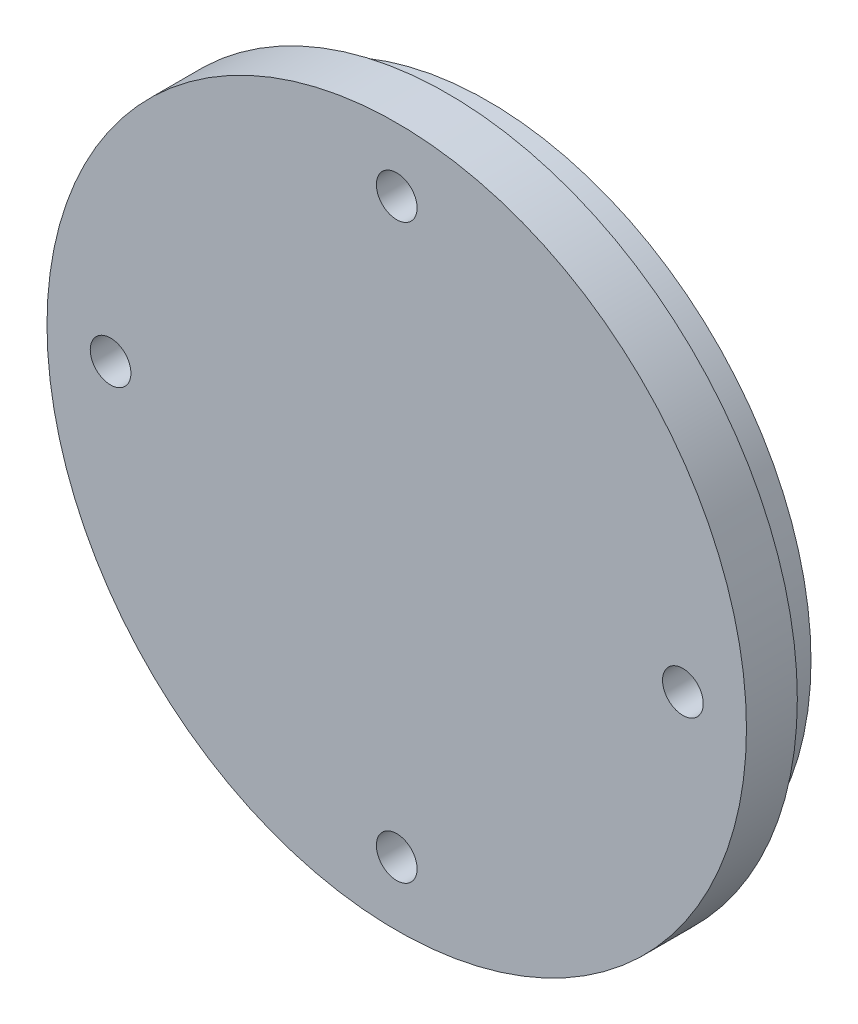
ISO-10303-21;
HEADER;
FILE_DESCRIPTION(('STEP AP214'),'2;1');
FILE_NAME('part.step','',(''),(''),'','','');
FILE_SCHEMA(('AUTOMOTIVE_DESIGN { 1 0 10303 214 1 1 1 1 }'));
ENDSEC;
DATA;
#1=APPLICATION_CONTEXT('core data for automotive mechanical design processes');
#2=APPLICATION_PROTOCOL_DEFINITION('international standard','automotive_design',2000,#1);
#3=PRODUCT_CONTEXT('',#1,'mechanical');
#4=PRODUCT('Part','Part','',(#3));
#5=PRODUCT_RELATED_PRODUCT_CATEGORY('part','',(#4));
#6=PRODUCT_DEFINITION_FORMATION('','',#4);
#7=PRODUCT_DEFINITION_CONTEXT('part definition',#1,'design');
#8=PRODUCT_DEFINITION('design','',#6,#7);
#9=PRODUCT_DEFINITION_SHAPE('','',#8);
#10=(LENGTH_UNIT() NAMED_UNIT(*) SI_UNIT(.MILLI.,.METRE.));
#11=(NAMED_UNIT(*) PLANE_ANGLE_UNIT() SI_UNIT($,.RADIAN.));
#12=(NAMED_UNIT(*) SI_UNIT($,.STERADIAN.) SOLID_ANGLE_UNIT());
#13=UNCERTAINTY_MEASURE_WITH_UNIT(LENGTH_MEASURE(1.E-05),#10,'distance_accuracy_value','');
#14=(GEOMETRIC_REPRESENTATION_CONTEXT(3) GLOBAL_UNCERTAINTY_ASSIGNED_CONTEXT((#13)) GLOBAL_UNIT_ASSIGNED_CONTEXT((#10,
#11,#12)) REPRESENTATION_CONTEXT('',''));
#15=CARTESIAN_POINT('',(0.,0.,0.));
#16=DIRECTION('',(0.,0.,1.));
#17=DIRECTION('',(1.,0.,0.));
#18=AXIS2_PLACEMENT_3D('',#15,#16,#17);
#19=CARTESIAN_POINT('',(0.,0.,4.));
#20=DIRECTION('',(0.,0.,-1.));
#21=DIRECTION('',(-1.,0.,0.));
#22=AXIS2_PLACEMENT_3D('',#19,#20,#21);
#23=CYLINDRICAL_SURFACE('',#22,27.5);
#24=CARTESIAN_POINT('',(0.,0.,4.));
#25=DIRECTION('',(0.,0.,1.));
#26=DIRECTION('',(1.,0.,0.));
#27=AXIS2_PLACEMENT_3D('',#24,#25,#26);
#28=CIRCLE('',#27,27.5);
#29=CARTESIAN_POINT('',(27.5,0.,4.));
#30=VERTEX_POINT('',#29);
#31=EDGE_CURVE('E40',#30,#30,#28,.T.);
#32=ORIENTED_EDGE('',*,*,#31,.F.);
#33=EDGE_LOOP('',(#32));
#34=FACE_BOUND('',#33,.T.);
#35=CARTESIAN_POINT('',(0.,0.,0.));
#36=DIRECTION('',(0.,0.,1.));
#37=DIRECTION('',(1.,0.,0.));
#38=AXIS2_PLACEMENT_3D('',#35,#36,#37);
#39=CIRCLE('',#38,27.5);
#40=CARTESIAN_POINT('',(27.5,0.,0.));
#41=VERTEX_POINT('',#40);
#42=EDGE_CURVE('E36',#41,#41,#39,.T.);
#43=ORIENTED_EDGE('',*,*,#42,.T.);
#44=EDGE_LOOP('',(#43));
#45=FACE_BOUND('',#44,.T.);
#46=ADVANCED_FACE('F33',(#34,#45),#23,.T.);
#47=CARTESIAN_POINT('',(0.,0.,4.));
#48=DIRECTION('',(0.,0.,1.));
#49=DIRECTION('',(1.,0.,0.));
#50=AXIS2_PLACEMENT_3D('',#47,#48,#49);
#51=PLANE('',#50);
#52=CARTESIAN_POINT('',(0.,22.5,4.));
#53=DIRECTION('',(0.,0.,-1.));
#54=DIRECTION('',(-1.,0.,0.));
#55=AXIS2_PLACEMENT_3D('',#52,#53,#54);
#56=CIRCLE('',#55,1.6);
#57=CARTESIAN_POINT('',(-1.6,22.5,4.));
#58=VERTEX_POINT('',#57);
#59=EDGE_CURVE('E49',#58,#58,#56,.T.);
#60=ORIENTED_EDGE('',*,*,#59,.T.);
#61=EDGE_LOOP('',(#60));
#62=FACE_BOUND('',#61,.T.);
#63=CARTESIAN_POINT('',(-22.5,0.,4.));
#64=DIRECTION('',(0.,0.,-1.));
#65=DIRECTION('',(-1.,0.,0.));
#66=AXIS2_PLACEMENT_3D('',#63,#64,#65);
#67=CIRCLE('',#66,1.6);
#68=CARTESIAN_POINT('',(-24.1,0.,4.));
#69=VERTEX_POINT('',#68);
#70=EDGE_CURVE('E65',#69,#69,#67,.T.);
#71=ORIENTED_EDGE('',*,*,#70,.T.);
#72=EDGE_LOOP('',(#71));
#73=FACE_BOUND('',#72,.T.);
#74=CARTESIAN_POINT('',(0.,-22.5,4.));
#75=DIRECTION('',(0.,0.,-1.));
#76=DIRECTION('',(-1.,0.,0.));
#77=AXIS2_PLACEMENT_3D('',#74,#75,#76);
#78=CIRCLE('',#77,1.6);
#79=CARTESIAN_POINT('',(-1.6,-22.5,4.));
#80=VERTEX_POINT('',#79);
#81=EDGE_CURVE('E59',#80,#80,#78,.T.);
#82=ORIENTED_EDGE('',*,*,#81,.T.);
#83=EDGE_LOOP('',(#82));
#84=FACE_BOUND('',#83,.T.);
#85=CARTESIAN_POINT('',(22.5,0.,4.));
#86=DIRECTION('',(0.,0.,-1.));
#87=DIRECTION('',(-1.,0.,0.));
#88=AXIS2_PLACEMENT_3D('',#85,#86,#87);
#89=CIRCLE('',#88,1.6);
#90=CARTESIAN_POINT('',(20.9,0.,4.));
#91=VERTEX_POINT('',#90);
#92=EDGE_CURVE('E53',#91,#91,#89,.T.);
#93=ORIENTED_EDGE('',*,*,#92,.T.);
#94=EDGE_LOOP('',(#93));
#95=FACE_BOUND('',#94,.T.);
#96=ORIENTED_EDGE('',*,*,#31,.T.);
#97=EDGE_LOOP('',(#96));
#98=FACE_BOUND('',#97,.T.);
#99=ADVANCED_FACE('F74',(#62,#73,#84,#95,#98),#51,.T.);
#100=CARTESIAN_POINT('',(0.,0.,0.));
#101=DIRECTION('',(0.,0.,1.));
#102=DIRECTION('',(1.,0.,0.));
#103=AXIS2_PLACEMENT_3D('',#100,#101,#102);
#104=PLANE('',#103);
#105=CARTESIAN_POINT('',(0.,0.,0.));
#106=DIRECTION('',(0.,0.,-1.));
#107=DIRECTION('',(-1.,0.,0.));
#108=AXIS2_PLACEMENT_3D('',#105,#106,#107);
#109=CIRCLE('',#108,25.4);
#110=CARTESIAN_POINT('',(-25.4,0.,0.));
#111=VERTEX_POINT('',#110);
#112=EDGE_CURVE('E10',#111,#111,#109,.T.);
#113=ORIENTED_EDGE('',*,*,#112,.F.);
#114=EDGE_LOOP('',(#113));
#115=FACE_BOUND('',#114,.T.);
#116=ORIENTED_EDGE('',*,*,#42,.F.);
#117=EDGE_LOOP('',(#116));
#118=FACE_BOUND('',#117,.T.);
#119=ADVANCED_FACE('F99',(#115,#118),#104,.F.);
#120=CARTESIAN_POINT('',(0.,0.,-3.175));
#121=DIRECTION('',(0.,0.,1.));
#122=DIRECTION('',(1.,0.,0.));
#123=AXIS2_PLACEMENT_3D('',#120,#121,#122);
#124=CYLINDRICAL_SURFACE('',#123,25.4);
#125=CARTESIAN_POINT('',(0.,0.,-3.175));
#126=DIRECTION('',(0.,0.,-1.));
#127=DIRECTION('',(-1.,0.,0.));
#128=AXIS2_PLACEMENT_3D('',#125,#126,#127);
#129=CIRCLE('',#128,25.4);
#130=CARTESIAN_POINT('',(-25.4,0.,-3.175));
#131=VERTEX_POINT('',#130);
#132=EDGE_CURVE('E46',#131,#131,#129,.T.);
#133=ORIENTED_EDGE('',*,*,#132,.F.);
#134=EDGE_LOOP('',(#133));
#135=FACE_BOUND('',#134,.T.);
#136=ORIENTED_EDGE('',*,*,#112,.T.);
#137=EDGE_LOOP('',(#136));
#138=FACE_BOUND('',#137,.T.);
#139=ADVANCED_FACE('F88',(#135,#138),#124,.T.);
#140=CARTESIAN_POINT('',(0.,0.,-3.175));
#141=DIRECTION('',(0.,0.,-1.));
#142=DIRECTION('',(-1.,0.,0.));
#143=AXIS2_PLACEMENT_3D('',#140,#141,#142);
#144=PLANE('',#143);
#145=CARTESIAN_POINT('',(0.,22.5,-3.175));
#146=DIRECTION('',(0.,0.,-1.));
#147=DIRECTION('',(-1.,0.,0.));
#148=AXIS2_PLACEMENT_3D('',#145,#146,#147);
#149=CIRCLE('',#148,1.6);
#150=CARTESIAN_POINT('',(-1.6,22.5,-3.175));
#151=VERTEX_POINT('',#150);
#152=EDGE_CURVE('E68',#151,#151,#149,.T.);
#153=ORIENTED_EDGE('',*,*,#152,.F.);
#154=EDGE_LOOP('',(#153));
#155=FACE_BOUND('',#154,.T.);
#156=CARTESIAN_POINT('',(-22.5,0.,-3.175));
#157=DIRECTION('',(0.,0.,-1.));
#158=DIRECTION('',(-1.,0.,0.));
#159=AXIS2_PLACEMENT_3D('',#156,#157,#158);
#160=CIRCLE('',#159,1.6);
#161=CARTESIAN_POINT('',(-24.1,0.,-3.175));
#162=VERTEX_POINT('',#161);
#163=EDGE_CURVE('E62',#162,#162,#160,.T.);
#164=ORIENTED_EDGE('',*,*,#163,.F.);
#165=EDGE_LOOP('',(#164));
#166=FACE_BOUND('',#165,.T.);
#167=CARTESIAN_POINT('',(0.,-22.5,-3.175));
#168=DIRECTION('',(0.,0.,-1.));
#169=DIRECTION('',(-1.,0.,0.));
#170=AXIS2_PLACEMENT_3D('',#167,#168,#169);
#171=CIRCLE('',#170,1.6);
#172=CARTESIAN_POINT('',(-1.6,-22.5,-3.175));
#173=VERTEX_POINT('',#172);
#174=EDGE_CURVE('E56',#173,#173,#171,.T.);
#175=ORIENTED_EDGE('',*,*,#174,.F.);
#176=EDGE_LOOP('',(#175));
#177=FACE_BOUND('',#176,.T.);
#178=CARTESIAN_POINT('',(22.5,0.,-3.175));
#179=DIRECTION('',(0.,0.,-1.));
#180=DIRECTION('',(-1.,0.,0.));
#181=AXIS2_PLACEMENT_3D('',#178,#179,#180);
#182=CIRCLE('',#181,1.6);
#183=CARTESIAN_POINT('',(20.9,0.,-3.175));
#184=VERTEX_POINT('',#183);
#185=EDGE_CURVE('E50',#184,#184,#182,.T.);
#186=ORIENTED_EDGE('',*,*,#185,.F.);
#187=EDGE_LOOP('',(#186));
#188=FACE_BOUND('',#187,.T.);
#189=ORIENTED_EDGE('',*,*,#132,.T.);
#190=EDGE_LOOP('',(#189));
#191=FACE_BOUND('',#190,.T.);
#192=ADVANCED_FACE('F84',(#155,#166,#177,#188,#191),#144,.T.);
#193=CARTESIAN_POINT('',(22.5,0.,4.));
#194=DIRECTION('',(0.,0.,-1.));
#195=DIRECTION('',(-1.,0.,0.));
#196=AXIS2_PLACEMENT_3D('',#193,#194,#195);
#197=CYLINDRICAL_SURFACE('',#196,1.6);
#198=ORIENTED_EDGE('',*,*,#92,.F.);
#199=EDGE_LOOP('',(#198));
#200=FACE_BOUND('',#199,.T.);
#201=ORIENTED_EDGE('',*,*,#185,.T.);
#202=EDGE_LOOP('',(#201));
#203=FACE_BOUND('',#202,.T.);
#204=ADVANCED_FACE('F87',(#200,#203),#197,.F.);
#205=CARTESIAN_POINT('',(0.,-22.5,4.));
#206=DIRECTION('',(0.,0.,-1.));
#207=DIRECTION('',(-1.,0.,0.));
#208=AXIS2_PLACEMENT_3D('',#205,#206,#207);
#209=CYLINDRICAL_SURFACE('',#208,1.6);
#210=ORIENTED_EDGE('',*,*,#81,.F.);
#211=EDGE_LOOP('',(#210));
#212=FACE_BOUND('',#211,.T.);
#213=ORIENTED_EDGE('',*,*,#174,.T.);
#214=EDGE_LOOP('',(#213));
#215=FACE_BOUND('',#214,.T.);
#216=ADVANCED_FACE('F144',(#212,#215),#209,.F.);
#217=CARTESIAN_POINT('',(-22.5,0.,4.));
#218=DIRECTION('',(0.,0.,-1.));
#219=DIRECTION('',(-1.,0.,0.));
#220=AXIS2_PLACEMENT_3D('',#217,#218,#219);
#221=CYLINDRICAL_SURFACE('',#220,1.6);
#222=ORIENTED_EDGE('',*,*,#70,.F.);
#223=EDGE_LOOP('',(#222));
#224=FACE_BOUND('',#223,.T.);
#225=ORIENTED_EDGE('',*,*,#163,.T.);
#226=EDGE_LOOP('',(#225));
#227=FACE_BOUND('',#226,.T.);
#228=ADVANCED_FACE('F80',(#224,#227),#221,.F.);
#229=CARTESIAN_POINT('',(0.,22.5,4.));
#230=DIRECTION('',(0.,0.,-1.));
#231=DIRECTION('',(-1.,0.,0.));
#232=AXIS2_PLACEMENT_3D('',#229,#230,#231);
#233=CYLINDRICAL_SURFACE('',#232,1.6);
#234=ORIENTED_EDGE('',*,*,#59,.F.);
#235=EDGE_LOOP('',(#234));
#236=FACE_BOUND('',#235,.T.);
#237=ORIENTED_EDGE('',*,*,#152,.T.);
#238=EDGE_LOOP('',(#237));
#239=FACE_BOUND('',#238,.T.);
#240=ADVANCED_FACE('F77',(#236,#239),#233,.F.);
#241=CLOSED_SHELL('',(#46,#99,#119,#139,#192,#204,#216,#228,#240));
#242=MANIFOLD_SOLID_BREP('B2',#241);
#243=ADVANCED_BREP_SHAPE_REPRESENTATION('',(#18,#242),#14);
#244=SHAPE_DEFINITION_REPRESENTATION(#9,#243);
ENDSEC;
END-ISO-10303-21;
